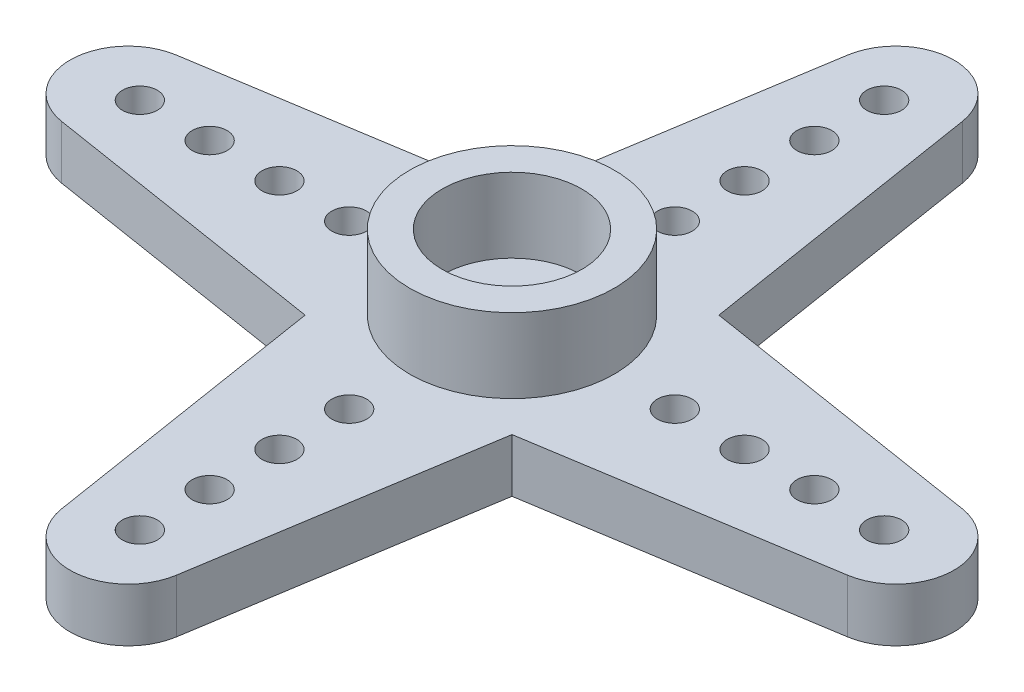
ISO-10303-21;
HEADER;
FILE_DESCRIPTION(('STEP AP214'),'2;1');
FILE_NAME('part.step','',(''),(''),'','','');
FILE_SCHEMA(('AUTOMOTIVE_DESIGN { 1 0 10303 214 1 1 1 1 }'));
ENDSEC;
DATA;
#1=APPLICATION_CONTEXT('core data for automotive mechanical design processes');
#2=APPLICATION_PROTOCOL_DEFINITION('international standard','automotive_design',2000,#1);
#3=PRODUCT_CONTEXT('',#1,'mechanical');
#4=PRODUCT('Part','Part','',(#3));
#5=PRODUCT_RELATED_PRODUCT_CATEGORY('part','',(#4));
#6=PRODUCT_DEFINITION_FORMATION('','',#4);
#7=PRODUCT_DEFINITION_CONTEXT('part definition',#1,'design');
#8=PRODUCT_DEFINITION('design','',#6,#7);
#9=PRODUCT_DEFINITION_SHAPE('','',#8);
#10=(LENGTH_UNIT() NAMED_UNIT(*) SI_UNIT(.MILLI.,.METRE.));
#11=(NAMED_UNIT(*) PLANE_ANGLE_UNIT() SI_UNIT($,.RADIAN.));
#12=(NAMED_UNIT(*) SI_UNIT($,.STERADIAN.) SOLID_ANGLE_UNIT());
#13=UNCERTAINTY_MEASURE_WITH_UNIT(LENGTH_MEASURE(1.E-05),#10,'distance_accuracy_value','');
#14=(GEOMETRIC_REPRESENTATION_CONTEXT(3) GLOBAL_UNCERTAINTY_ASSIGNED_CONTEXT((#13)) GLOBAL_UNIT_ASSIGNED_CONTEXT((#10,
#11,#12)) REPRESENTATION_CONTEXT('',''));
#15=CARTESIAN_POINT('',(0.,0.,0.));
#16=DIRECTION('',(0.,0.,1.));
#17=DIRECTION('',(1.,0.,0.));
#18=AXIS2_PLACEMENT_3D('',#15,#16,#17);
#19=CARTESIAN_POINT('',(5.02767726414761,2.3,-0.799360567392308));
#20=DIRECTION('',(0.987595455307073,0.,-0.157019797021949));
#21=DIRECTION('',(-0.157019797021949,0.,-0.987595455307074));
#22=AXIS2_PLACEMENT_3D('',#19,#20,#21);
#23=PLANE('',#22);
#24=DIRECTION('',(0.157019797021949,0.,0.987595455307074));
#25=VECTOR('',#24,1.);
#26=CARTESIAN_POINT('',(5.02767726414761,2.3,-0.799360567392308));
#27=LINE('',#26,#25);
#28=CARTESIAN_POINT('',(2.46898863826769,2.3,-16.8925494925549));
#29=VERTEX_POINT('',#28);
#30=CARTESIAN_POINT('',(4.44763132459011,2.3,-4.44763132459009));
#31=VERTEX_POINT('',#30);
#32=EDGE_CURVE('E101',#29,#31,#27,.T.);
#33=ORIENTED_EDGE('',*,*,#32,.T.);
#34=DIRECTION('',(0.,-1.,0.));
#35=VECTOR('',#34,1.);
#36=CARTESIAN_POINT('',(4.44763132459011,2.3,-4.44763132459009));
#37=LINE('',#36,#35);
#38=CARTESIAN_POINT('',(4.44763132459011,0.,-4.44763132459009));
#39=VERTEX_POINT('',#38);
#40=EDGE_CURVE('E11',#31,#39,#37,.T.);
#41=ORIENTED_EDGE('',*,*,#40,.T.);
#42=DIRECTION('',(0.157019797021949,0.,0.987595455307074));
#43=VECTOR('',#42,1.);
#44=CARTESIAN_POINT('',(5.02767726414761,0.,-0.799360567392308));
#45=LINE('',#44,#43);
#46=CARTESIAN_POINT('',(2.46898863826769,0.,-16.8925494925549));
#47=VERTEX_POINT('',#46);
#48=EDGE_CURVE('E87',#47,#39,#45,.T.);
#49=ORIENTED_EDGE('',*,*,#48,.F.);
#50=DIRECTION('',(0.,-1.,0.));
#51=VECTOR('',#50,1.);
#52=CARTESIAN_POINT('',(2.46898863826769,2.3,-16.8925494925549));
#53=LINE('',#52,#51);
#54=EDGE_CURVE('E60',#29,#47,#53,.T.);
#55=ORIENTED_EDGE('',*,*,#54,.F.);
#56=EDGE_LOOP('',(#33,#41,#49,#55));
#57=FACE_BOUND('',#56,.T.);
#58=ADVANCED_FACE('F36',(#57),#23,.T.);
#59=CARTESIAN_POINT('',(0.,2.3,0.));
#60=DIRECTION('',(0.,1.,0.));
#61=DIRECTION('',(0.,0.,1.));
#62=AXIS2_PLACEMENT_3D('',#59,#60,#61);
#63=PLANE('',#62);
#64=CARTESIAN_POINT('',(0.,2.3,0.));
#65=DIRECTION('',(0.,1.,0.));
#66=DIRECTION('',(0.,0.,1.));
#67=AXIS2_PLACEMENT_3D('',#64,#65,#66);
#68=CIRCLE('',#67,1.5);
#69=CARTESIAN_POINT('',(0.,2.3,1.5));
#70=VERTEX_POINT('',#69);
#71=EDGE_CURVE('E114',#70,#70,#68,.T.);
#72=ORIENTED_EDGE('',*,*,#71,.F.);
#73=EDGE_LOOP('',(#72));
#74=FACE_BOUND('',#73,.T.);
#75=CARTESIAN_POINT('',(0.,2.3,0.));
#76=DIRECTION('',(0.,1.,0.));
#77=DIRECTION('',(0.,0.,1.));
#78=AXIS2_PLACEMENT_3D('',#75,#76,#77);
#79=CIRCLE('',#78,3.);
#80=CARTESIAN_POINT('',(0.,2.3,3.));
#81=VERTEX_POINT('',#80);
#82=EDGE_CURVE('E78',#81,#81,#79,.T.);
#83=ORIENTED_EDGE('',*,*,#82,.T.);
#84=EDGE_LOOP('',(#83));
#85=FACE_BOUND('',#84,.T.);
#86=ADVANCED_FACE('F165',(#74,#85),#63,.T.);
#87=DIRECTION('',(-0.987595455307073,0.,-0.157019797021953));
#88=VECTOR('',#87,1.);
#89=CARTESIAN_POINT('',(0.799360567392327,2.3,-5.0276772641476));
#90=LINE('',#89,#88);
#91=CARTESIAN_POINT('',(16.8925494925549,2.3,-2.46898863826762));
#92=VERTEX_POINT('',#91);
#93=EDGE_CURVE('E258',#92,#31,#90,.T.);
#94=ORIENTED_EDGE('',*,*,#93,.T.);
#95=ORIENTED_EDGE('',*,*,#32,.F.);
#96=CARTESIAN_POINT('',(0.,2.3,-16.5));
#97=DIRECTION('',(0.,-1.,0.));
#98=DIRECTION('',(0.,0.,-1.));
#99=AXIS2_PLACEMENT_3D('',#96,#97,#98);
#100=CIRCLE('',#99,2.5);
#101=CARTESIAN_POINT('',(-2.46898863826768,2.3,-16.8925494925549));
#102=VERTEX_POINT('',#101);
#103=EDGE_CURVE('E76',#102,#29,#100,.T.);
#104=ORIENTED_EDGE('',*,*,#103,.F.);
#105=DIRECTION('',(-0.15701979702195,0.,0.987595455307073));
#106=VECTOR('',#105,1.);
#107=CARTESIAN_POINT('',(-5.02767726414761,2.3,-0.799360567392309));
#108=LINE('',#107,#106);
#109=CARTESIAN_POINT('',(-4.4476313245901,2.3,-4.44763132459014));
#110=VERTEX_POINT('',#109);
#111=EDGE_CURVE('E122',#102,#110,#108,.T.);
#112=ORIENTED_EDGE('',*,*,#111,.T.);
#113=DIRECTION('',(0.987595455307075,0.,-0.157019797021939));
#114=VECTOR('',#113,1.);
#115=CARTESIAN_POINT('',(-0.799360567392255,2.3,-5.02767726414762));
#116=LINE('',#115,#114);
#117=CARTESIAN_POINT('',(-16.8925494925548,2.3,-2.46898863826786));
#118=VERTEX_POINT('',#117);
#119=EDGE_CURVE('E51',#118,#110,#116,.T.);
#120=ORIENTED_EDGE('',*,*,#119,.F.);
#121=CARTESIAN_POINT('',(-16.5,2.3,-1.74848993491328E-13));
#122=DIRECTION('',(0.,-1.,0.));
#123=DIRECTION('',(-1.,0.,0.));
#124=AXIS2_PLACEMENT_3D('',#121,#122,#123);
#125=CIRCLE('',#124,2.5);
#126=CARTESIAN_POINT('',(-16.8925494925549,2.3,2.46898863826751));
#127=VERTEX_POINT('',#126);
#128=EDGE_CURVE('E352',#127,#118,#125,.T.);
#129=ORIENTED_EDGE('',*,*,#128,.F.);
#130=DIRECTION('',(0.987595455307072,0.,0.15701979702196));
#131=VECTOR('',#130,1.);
#132=CARTESIAN_POINT('',(-0.799360567392362,2.3,5.0276772641476));
#133=LINE('',#132,#131);
#134=CARTESIAN_POINT('',(-4.44763132459011,2.3,4.44763132459006));
#135=VERTEX_POINT('',#134);
#136=EDGE_CURVE('E355',#127,#135,#133,.T.);
#137=ORIENTED_EDGE('',*,*,#136,.T.);
#138=DIRECTION('',(-0.157019797021949,0.,-0.987595455307074));
#139=VECTOR('',#138,1.);
#140=CARTESIAN_POINT('',(-5.02767726414761,2.3,0.799360567392308));
#141=LINE('',#140,#139);
#142=CARTESIAN_POINT('',(-2.46898863826769,2.3,16.8925494925549));
#143=VERTEX_POINT('',#142);
#144=EDGE_CURVE('E277',#143,#135,#141,.T.);
#145=ORIENTED_EDGE('',*,*,#144,.F.);
#146=CARTESIAN_POINT('',(0.,2.3,16.5));
#147=DIRECTION('',(0.,-1.,0.));
#148=DIRECTION('',(0.,0.,1.));
#149=AXIS2_PLACEMENT_3D('',#146,#147,#148);
#150=CIRCLE('',#149,2.5);
#151=CARTESIAN_POINT('',(2.46898863826768,2.3,16.8925494925549));
#152=VERTEX_POINT('',#151);
#153=EDGE_CURVE('E305',#152,#143,#150,.T.);
#154=ORIENTED_EDGE('',*,*,#153,.F.);
#155=DIRECTION('',(0.15701979702195,0.,-0.987595455307073));
#156=VECTOR('',#155,1.);
#157=CARTESIAN_POINT('',(5.02767726414761,2.3,0.799360567392309));
#158=LINE('',#157,#156);
#159=CARTESIAN_POINT('',(4.4476313245901,2.3,4.44763132459012));
#160=VERTEX_POINT('',#159);
#161=EDGE_CURVE('E308',#152,#160,#158,.T.);
#162=ORIENTED_EDGE('',*,*,#161,.T.);
#163=DIRECTION('',(-0.987595455307074,0.,0.157019797021946));
#164=VECTOR('',#163,1.);
#165=CARTESIAN_POINT('',(0.79936056739229,2.3,5.02767726414761));
#166=LINE('',#165,#164);
#167=CARTESIAN_POINT('',(16.8925494925549,2.3,2.46898863826775));
#168=VERTEX_POINT('',#167);
#169=EDGE_CURVE('E227',#168,#160,#166,.T.);
#170=ORIENTED_EDGE('',*,*,#169,.F.);
#171=CARTESIAN_POINT('',(16.5,2.3,0.));
#172=DIRECTION('',(0.,-1.,0.));
#173=DIRECTION('',(1.,0.,0.));
#174=AXIS2_PLACEMENT_3D('',#171,#172,#173);
#175=CIRCLE('',#174,2.5);
#176=EDGE_CURVE('E255',#92,#168,#175,.T.);
#177=ORIENTED_EDGE('',*,*,#176,.F.);
#178=EDGE_LOOP('',(#94,#95,#104,#112,#120,#129,#137,#145,#154,#162,#170,#177));
#179=FACE_BOUND('',#178,.T.);
#180=CARTESIAN_POINT('',(16.,2.3,0.));
#181=DIRECTION('',(0.,-1.,0.));
#182=DIRECTION('',(1.,0.,0.));
#183=AXIS2_PLACEMENT_3D('',#180,#181,#182);
#184=CIRCLE('',#183,0.75);
#185=CARTESIAN_POINT('',(16.75,2.3,0.));
#186=VERTEX_POINT('',#185);
#187=EDGE_CURVE('E260',#186,#186,#184,.T.);
#188=ORIENTED_EDGE('',*,*,#187,.T.);
#189=EDGE_LOOP('',(#188));
#190=FACE_BOUND('',#189,.T.);
#191=CARTESIAN_POINT('',(13.,2.3,0.));
#192=DIRECTION('',(0.,-1.,0.));
#193=DIRECTION('',(1.,0.,0.));
#194=AXIS2_PLACEMENT_3D('',#191,#192,#193);
#195=CIRCLE('',#194,0.750000000000001);
#196=CARTESIAN_POINT('',(13.75,2.3,0.));
#197=VERTEX_POINT('',#196);
#198=EDGE_CURVE('E263',#197,#197,#195,.T.);
#199=ORIENTED_EDGE('',*,*,#198,.T.);
#200=EDGE_LOOP('',(#199));
#201=FACE_BOUND('',#200,.T.);
#202=CARTESIAN_POINT('',(10.,2.3,0.));
#203=DIRECTION('',(0.,-1.,0.));
#204=DIRECTION('',(1.,0.,0.));
#205=AXIS2_PLACEMENT_3D('',#202,#203,#204);
#206=CIRCLE('',#205,0.750000000000001);
#207=CARTESIAN_POINT('',(10.75,2.3,0.));
#208=VERTEX_POINT('',#207);
#209=EDGE_CURVE('E266',#208,#208,#206,.T.);
#210=ORIENTED_EDGE('',*,*,#209,.T.);
#211=EDGE_LOOP('',(#210));
#212=FACE_BOUND('',#211,.T.);
#213=CARTESIAN_POINT('',(7.,2.3,0.));
#214=DIRECTION('',(0.,-1.,0.));
#215=DIRECTION('',(1.,0.,0.));
#216=AXIS2_PLACEMENT_3D('',#213,#214,#215);
#217=CIRCLE('',#216,0.75);
#218=CARTESIAN_POINT('',(7.75,2.3,0.));
#219=VERTEX_POINT('',#218);
#220=EDGE_CURVE('E233',#219,#219,#217,.T.);
#221=ORIENTED_EDGE('',*,*,#220,.T.);
#222=EDGE_LOOP('',(#221));
#223=FACE_BOUND('',#222,.T.);
#224=CARTESIAN_POINT('',(0.,2.3,16.));
#225=DIRECTION('',(0.,-1.,0.));
#226=DIRECTION('',(0.,0.,1.));
#227=AXIS2_PLACEMENT_3D('',#224,#225,#226);
#228=CIRCLE('',#227,0.75);
#229=CARTESIAN_POINT('',(0.,2.3,16.75));
#230=VERTEX_POINT('',#229);
#231=EDGE_CURVE('E311',#230,#230,#228,.T.);
#232=ORIENTED_EDGE('',*,*,#231,.T.);
#233=EDGE_LOOP('',(#232));
#234=FACE_BOUND('',#233,.T.);
#235=CARTESIAN_POINT('',(0.,2.3,13.));
#236=DIRECTION('',(0.,-1.,0.));
#237=DIRECTION('',(0.,0.,1.));
#238=AXIS2_PLACEMENT_3D('',#235,#236,#237);
#239=CIRCLE('',#238,0.750000000000001);
#240=CARTESIAN_POINT('',(0.,2.3,13.75));
#241=VERTEX_POINT('',#240);
#242=EDGE_CURVE('E314',#241,#241,#239,.T.);
#243=ORIENTED_EDGE('',*,*,#242,.T.);
#244=EDGE_LOOP('',(#243));
#245=FACE_BOUND('',#244,.T.);
#246=CARTESIAN_POINT('',(0.,2.3,10.));
#247=DIRECTION('',(0.,-1.,0.));
#248=DIRECTION('',(0.,0.,1.));
#249=AXIS2_PLACEMENT_3D('',#246,#247,#248);
#250=CIRCLE('',#249,0.750000000000001);
#251=CARTESIAN_POINT('',(0.,2.3,10.75));
#252=VERTEX_POINT('',#251);
#253=EDGE_CURVE('E317',#252,#252,#250,.T.);
#254=ORIENTED_EDGE('',*,*,#253,.T.);
#255=EDGE_LOOP('',(#254));
#256=FACE_BOUND('',#255,.T.);
#257=CARTESIAN_POINT('',(0.,2.3,7.));
#258=DIRECTION('',(0.,-1.,0.));
#259=DIRECTION('',(0.,0.,1.));
#260=AXIS2_PLACEMENT_3D('',#257,#258,#259);
#261=CIRCLE('',#260,0.75);
#262=CARTESIAN_POINT('',(0.,2.3,7.75));
#263=VERTEX_POINT('',#262);
#264=EDGE_CURVE('E283',#263,#263,#261,.T.);
#265=ORIENTED_EDGE('',*,*,#264,.T.);
#266=EDGE_LOOP('',(#265));
#267=FACE_BOUND('',#266,.T.);
#268=CARTESIAN_POINT('',(-7.,2.3,0.));
#269=DIRECTION('',(0.,-1.,0.));
#270=DIRECTION('',(-1.,0.,0.));
#271=AXIS2_PLACEMENT_3D('',#268,#269,#270);
#272=CIRCLE('',#271,0.75);
#273=CARTESIAN_POINT('',(-7.75,2.3,0.));
#274=VERTEX_POINT('',#273);
#275=EDGE_CURVE('E332',#274,#274,#272,.T.);
#276=ORIENTED_EDGE('',*,*,#275,.T.);
#277=EDGE_LOOP('',(#276));
#278=FACE_BOUND('',#277,.T.);
#279=CARTESIAN_POINT('',(-10.,2.3,-1.05969086964441E-13));
#280=DIRECTION('',(0.,-1.,0.));
#281=DIRECTION('',(-1.,0.,0.));
#282=AXIS2_PLACEMENT_3D('',#279,#280,#281);
#283=CIRCLE('',#282,0.750000000000001);
#284=CARTESIAN_POINT('',(-10.75,2.3,-1.13824919976838E-13));
#285=VERTEX_POINT('',#284);
#286=EDGE_CURVE('E364',#285,#285,#283,.T.);
#287=ORIENTED_EDGE('',*,*,#286,.T.);
#288=EDGE_LOOP('',(#287));
#289=FACE_BOUND('',#288,.T.);
#290=CARTESIAN_POINT('',(-13.,2.3,-1.37759813053774E-13));
#291=DIRECTION('',(0.,-1.,0.));
#292=DIRECTION('',(-1.,0.,0.));
#293=AXIS2_PLACEMENT_3D('',#290,#291,#292);
#294=CIRCLE('',#293,0.750000000000001);
#295=CARTESIAN_POINT('',(-13.75,2.3,-1.45615646066171E-13));
#296=VERTEX_POINT('',#295);
#297=EDGE_CURVE('E361',#296,#296,#294,.T.);
#298=ORIENTED_EDGE('',*,*,#297,.T.);
#299=EDGE_LOOP('',(#298));
#300=FACE_BOUND('',#299,.T.);
#301=CARTESIAN_POINT('',(-16.,2.3,-1.69550539143106E-13));
#302=DIRECTION('',(0.,-1.,0.));
#303=DIRECTION('',(-1.,0.,0.));
#304=AXIS2_PLACEMENT_3D('',#301,#302,#303);
#305=CIRCLE('',#304,0.75);
#306=CARTESIAN_POINT('',(-16.75,2.3,-1.77406372155503E-13));
#307=VERTEX_POINT('',#306);
#308=EDGE_CURVE('E358',#307,#307,#305,.T.);
#309=ORIENTED_EDGE('',*,*,#308,.T.);
#310=EDGE_LOOP('',(#309));
#311=FACE_BOUND('',#310,.T.);
#312=CARTESIAN_POINT('',(0.,2.3,0.));
#313=DIRECTION('',(0.,1.,0.));
#314=DIRECTION('',(0.,0.,1.));
#315=AXIS2_PLACEMENT_3D('',#312,#313,#314);
#316=CIRCLE('',#315,4.4);
#317=CARTESIAN_POINT('',(0.,2.3,4.4));
#318=VERTEX_POINT('',#317);
#319=EDGE_CURVE('E111',#318,#318,#316,.T.);
#320=ORIENTED_EDGE('',*,*,#319,.F.);
#321=EDGE_LOOP('',(#320));
#322=FACE_BOUND('',#321,.T.);
#323=CARTESIAN_POINT('',(0.,2.3,-7.));
#324=DIRECTION('',(0.,-1.,0.));
#325=DIRECTION('',(0.,0.,-1.));
#326=AXIS2_PLACEMENT_3D('',#323,#324,#325);
#327=CIRCLE('',#326,0.75);
#328=CARTESIAN_POINT('',(0.,2.3,-7.75));
#329=VERTEX_POINT('',#328);
#330=EDGE_CURVE('E93',#329,#329,#327,.T.);
#331=ORIENTED_EDGE('',*,*,#330,.T.);
#332=EDGE_LOOP('',(#331));
#333=FACE_BOUND('',#332,.T.);
#334=CARTESIAN_POINT('',(0.,2.3,-10.));
#335=DIRECTION('',(0.,-1.,0.));
#336=DIRECTION('',(0.,0.,-1.));
#337=AXIS2_PLACEMENT_3D('',#334,#335,#336);
#338=CIRCLE('',#337,0.750000000000001);
#339=CARTESIAN_POINT('',(0.,2.3,-10.75));
#340=VERTEX_POINT('',#339);
#341=EDGE_CURVE('E96',#340,#340,#338,.T.);
#342=ORIENTED_EDGE('',*,*,#341,.T.);
#343=EDGE_LOOP('',(#342));
#344=FACE_BOUND('',#343,.T.);
#345=CARTESIAN_POINT('',(0.,2.3,-13.));
#346=DIRECTION('',(0.,-1.,0.));
#347=DIRECTION('',(0.,0.,-1.));
#348=AXIS2_PLACEMENT_3D('',#345,#346,#347);
#349=CIRCLE('',#348,0.750000000000001);
#350=CARTESIAN_POINT('',(0.,2.3,-13.75));
#351=VERTEX_POINT('',#350);
#352=EDGE_CURVE('E135',#351,#351,#349,.T.);
#353=ORIENTED_EDGE('',*,*,#352,.T.);
#354=EDGE_LOOP('',(#353));
#355=FACE_BOUND('',#354,.T.);
#356=CARTESIAN_POINT('',(0.,2.3,-16.));
#357=DIRECTION('',(0.,-1.,0.));
#358=DIRECTION('',(0.,0.,-1.));
#359=AXIS2_PLACEMENT_3D('',#356,#357,#358);
#360=CIRCLE('',#359,0.75);
#361=CARTESIAN_POINT('',(0.,2.3,-16.75));
#362=VERTEX_POINT('',#361);
#363=EDGE_CURVE('E131',#362,#362,#360,.T.);
#364=ORIENTED_EDGE('',*,*,#363,.T.);
#365=EDGE_LOOP('',(#364));
#366=FACE_BOUND('',#365,.T.);
#367=ADVANCED_FACE('F127',(#179,#190,#201,#212,#223,#234,#245,#256,#267,#278,#289,#300,#311,
#322,#333,#344,#355,#366),#63,.T.);
#368=CARTESIAN_POINT('',(0.,0.,0.));
#369=DIRECTION('',(0.,1.,0.));
#370=DIRECTION('',(0.,0.,1.));
#371=AXIS2_PLACEMENT_3D('',#368,#369,#370);
#372=PLANE('',#371);
#373=ORIENTED_EDGE('',*,*,#48,.T.);
#374=DIRECTION('',(-0.987595455307073,0.,-0.157019797021953));
#375=VECTOR('',#374,1.);
#376=CARTESIAN_POINT('',(0.799360567392327,0.,-5.0276772641476));
#377=LINE('',#376,#375);
#378=CARTESIAN_POINT('',(16.8925494925549,0.,-2.46898863826762));
#379=VERTEX_POINT('',#378);
#380=EDGE_CURVE('E237',#379,#39,#377,.T.);
#381=ORIENTED_EDGE('',*,*,#380,.F.);
#382=CARTESIAN_POINT('',(16.5,0.,0.));
#383=DIRECTION('',(0.,-1.,0.));
#384=DIRECTION('',(1.,0.,0.));
#385=AXIS2_PLACEMENT_3D('',#382,#383,#384);
#386=CIRCLE('',#385,2.5);
#387=CARTESIAN_POINT('',(16.8925494925549,0.,2.46898863826775));
#388=VERTEX_POINT('',#387);
#389=EDGE_CURVE('E234',#379,#388,#386,.T.);
#390=ORIENTED_EDGE('',*,*,#389,.T.);
#391=DIRECTION('',(-0.987595455307074,0.,0.157019797021946));
#392=VECTOR('',#391,1.);
#393=CARTESIAN_POINT('',(0.79936056739229,0.,5.02767726414761));
#394=LINE('',#393,#392);
#395=CARTESIAN_POINT('',(4.4476313245901,0.,4.44763132459012));
#396=VERTEX_POINT('',#395);
#397=EDGE_CURVE('E230',#388,#396,#394,.T.);
#398=ORIENTED_EDGE('',*,*,#397,.T.);
#399=DIRECTION('',(0.15701979702195,0.,-0.987595455307073));
#400=VECTOR('',#399,1.);
#401=CARTESIAN_POINT('',(5.02767726414761,0.,0.799360567392309));
#402=LINE('',#401,#400);
#403=CARTESIAN_POINT('',(2.46898863826768,0.,16.8925494925549));
#404=VERTEX_POINT('',#403);
#405=EDGE_CURVE('E287',#404,#396,#402,.T.);
#406=ORIENTED_EDGE('',*,*,#405,.F.);
#407=CARTESIAN_POINT('',(0.,0.,16.5));
#408=DIRECTION('',(0.,-1.,0.));
#409=DIRECTION('',(0.,0.,1.));
#410=AXIS2_PLACEMENT_3D('',#407,#408,#409);
#411=CIRCLE('',#410,2.5);
#412=CARTESIAN_POINT('',(-2.46898863826769,0.,16.8925494925549));
#413=VERTEX_POINT('',#412);
#414=EDGE_CURVE('E284',#404,#413,#411,.T.);
#415=ORIENTED_EDGE('',*,*,#414,.T.);
#416=DIRECTION('',(-0.157019797021949,0.,-0.987595455307074));
#417=VECTOR('',#416,1.);
#418=CARTESIAN_POINT('',(-5.02767726414761,0.,0.799360567392308));
#419=LINE('',#418,#417);
#420=CARTESIAN_POINT('',(-4.44763132459011,0.,4.44763132459006));
#421=VERTEX_POINT('',#420);
#422=EDGE_CURVE('E280',#413,#421,#419,.T.);
#423=ORIENTED_EDGE('',*,*,#422,.T.);
#424=DIRECTION('',(0.987595455307072,0.,0.15701979702196));
#425=VECTOR('',#424,1.);
#426=CARTESIAN_POINT('',(-0.799360567392362,0.,5.0276772641476));
#427=LINE('',#426,#425);
#428=CARTESIAN_POINT('',(-16.8925494925549,0.,2.46898863826751));
#429=VERTEX_POINT('',#428);
#430=EDGE_CURVE('E336',#429,#421,#427,.T.);
#431=ORIENTED_EDGE('',*,*,#430,.F.);
#432=CARTESIAN_POINT('',(-16.5,0.,-1.74848993491328E-13));
#433=DIRECTION('',(0.,-1.,0.));
#434=DIRECTION('',(-1.,0.,0.));
#435=AXIS2_PLACEMENT_3D('',#432,#433,#434);
#436=CIRCLE('',#435,2.5);
#437=CARTESIAN_POINT('',(-16.8925494925548,0.,-2.46898863826786));
#438=VERTEX_POINT('',#437);
#439=EDGE_CURVE('E333',#429,#438,#436,.T.);
#440=ORIENTED_EDGE('',*,*,#439,.T.);
#441=DIRECTION('',(0.987595455307075,0.,-0.157019797021939));
#442=VECTOR('',#441,1.);
#443=CARTESIAN_POINT('',(-0.799360567392255,0.,-5.02767726414762));
#444=LINE('',#443,#442);
#445=CARTESIAN_POINT('',(-4.4476313245901,0.,-4.44763132459014));
#446=VERTEX_POINT('',#445);
#447=EDGE_CURVE('E330',#438,#446,#444,.T.);
#448=ORIENTED_EDGE('',*,*,#447,.T.);
#449=DIRECTION('',(-0.15701979702195,0.,0.987595455307073));
#450=VECTOR('',#449,1.);
#451=CARTESIAN_POINT('',(-5.02767726414761,0.,-0.799360567392309));
#452=LINE('',#451,#450);
#453=CARTESIAN_POINT('',(-2.46898863826768,0.,-16.8925494925549));
#454=VERTEX_POINT('',#453);
#455=EDGE_CURVE('E90',#454,#446,#452,.T.);
#456=ORIENTED_EDGE('',*,*,#455,.F.);
#457=CARTESIAN_POINT('',(0.,0.,-16.5));
#458=DIRECTION('',(0.,-1.,0.));
#459=DIRECTION('',(0.,0.,-1.));
#460=AXIS2_PLACEMENT_3D('',#457,#458,#459);
#461=CIRCLE('',#460,2.5);
#462=EDGE_CURVE('E74',#454,#47,#461,.T.);
#463=ORIENTED_EDGE('',*,*,#462,.T.);
#464=EDGE_LOOP('',(#373,#381,#390,#398,#406,#415,#423,#431,#440,#448,#456,#463));
#465=FACE_BOUND('',#464,.T.);
#466=CARTESIAN_POINT('',(-16.,0.,-1.69550539143106E-13));
#467=DIRECTION('',(0.,-1.,0.));
#468=DIRECTION('',(-1.,0.,0.));
#469=AXIS2_PLACEMENT_3D('',#466,#467,#468);
#470=CIRCLE('',#469,0.75);
#471=CARTESIAN_POINT('',(-16.75,0.,-1.77406372155503E-13));
#472=VERTEX_POINT('',#471);
#473=EDGE_CURVE('E339',#472,#472,#470,.T.);
#474=ORIENTED_EDGE('',*,*,#473,.F.);
#475=EDGE_LOOP('',(#474));
#476=FACE_BOUND('',#475,.T.);
#477=CARTESIAN_POINT('',(-13.,0.,-1.37759813053774E-13));
#478=DIRECTION('',(0.,-1.,0.));
#479=DIRECTION('',(-1.,0.,0.));
#480=AXIS2_PLACEMENT_3D('',#477,#478,#479);
#481=CIRCLE('',#480,0.750000000000001);
#482=CARTESIAN_POINT('',(-13.75,0.,-1.45615646066171E-13));
#483=VERTEX_POINT('',#482);
#484=EDGE_CURVE('E342',#483,#483,#481,.T.);
#485=ORIENTED_EDGE('',*,*,#484,.F.);
#486=EDGE_LOOP('',(#485));
#487=FACE_BOUND('',#486,.T.);
#488=CARTESIAN_POINT('',(-10.,0.,-1.05969086964441E-13));
#489=DIRECTION('',(0.,-1.,0.));
#490=DIRECTION('',(-1.,0.,0.));
#491=AXIS2_PLACEMENT_3D('',#488,#489,#490);
#492=CIRCLE('',#491,0.750000000000001);
#493=CARTESIAN_POINT('',(-10.75,0.,-1.13824919976838E-13));
#494=VERTEX_POINT('',#493);
#495=EDGE_CURVE('E345',#494,#494,#492,.T.);
#496=ORIENTED_EDGE('',*,*,#495,.F.);
#497=EDGE_LOOP('',(#496));
#498=FACE_BOUND('',#497,.T.);
#499=CARTESIAN_POINT('',(-7.,0.,0.));
#500=DIRECTION('',(0.,-1.,0.));
#501=DIRECTION('',(-1.,0.,0.));
#502=AXIS2_PLACEMENT_3D('',#499,#500,#501);
#503=CIRCLE('',#502,0.75);
#504=CARTESIAN_POINT('',(-7.75,0.,0.));
#505=VERTEX_POINT('',#504);
#506=EDGE_CURVE('E348',#505,#505,#503,.T.);
#507=ORIENTED_EDGE('',*,*,#506,.F.);
#508=EDGE_LOOP('',(#507));
#509=FACE_BOUND('',#508,.T.);
#510=CARTESIAN_POINT('',(0.,0.,16.));
#511=DIRECTION('',(0.,-1.,0.));
#512=DIRECTION('',(0.,0.,1.));
#513=AXIS2_PLACEMENT_3D('',#510,#511,#512);
#514=CIRCLE('',#513,0.75);
#515=CARTESIAN_POINT('',(0.,0.,16.75));
#516=VERTEX_POINT('',#515);
#517=EDGE_CURVE('E290',#516,#516,#514,.T.);
#518=ORIENTED_EDGE('',*,*,#517,.F.);
#519=EDGE_LOOP('',(#518));
#520=FACE_BOUND('',#519,.T.);
#521=CARTESIAN_POINT('',(0.,0.,13.));
#522=DIRECTION('',(0.,-1.,0.));
#523=DIRECTION('',(0.,0.,1.));
#524=AXIS2_PLACEMENT_3D('',#521,#522,#523);
#525=CIRCLE('',#524,0.750000000000001);
#526=CARTESIAN_POINT('',(0.,0.,13.75));
#527=VERTEX_POINT('',#526);
#528=EDGE_CURVE('E293',#527,#527,#525,.T.);
#529=ORIENTED_EDGE('',*,*,#528,.F.);
#530=EDGE_LOOP('',(#529));
#531=FACE_BOUND('',#530,.T.);
#532=CARTESIAN_POINT('',(0.,0.,10.));
#533=DIRECTION('',(0.,-1.,0.));
#534=DIRECTION('',(0.,0.,1.));
#535=AXIS2_PLACEMENT_3D('',#532,#533,#534);
#536=CIRCLE('',#535,0.750000000000001);
#537=CARTESIAN_POINT('',(0.,0.,10.75));
#538=VERTEX_POINT('',#537);
#539=EDGE_CURVE('E296',#538,#538,#536,.T.);
#540=ORIENTED_EDGE('',*,*,#539,.F.);
#541=EDGE_LOOP('',(#540));
#542=FACE_BOUND('',#541,.T.);
#543=CARTESIAN_POINT('',(0.,0.,7.));
#544=DIRECTION('',(0.,-1.,0.));
#545=DIRECTION('',(0.,0.,1.));
#546=AXIS2_PLACEMENT_3D('',#543,#544,#545);
#547=CIRCLE('',#546,0.75);
#548=CARTESIAN_POINT('',(0.,0.,7.75));
#549=VERTEX_POINT('',#548);
#550=EDGE_CURVE('E299',#549,#549,#547,.T.);
#551=ORIENTED_EDGE('',*,*,#550,.F.);
#552=EDGE_LOOP('',(#551));
#553=FACE_BOUND('',#552,.T.);
#554=CARTESIAN_POINT('',(16.,0.,0.));
#555=DIRECTION('',(0.,-1.,0.));
#556=DIRECTION('',(1.,0.,0.));
#557=AXIS2_PLACEMENT_3D('',#554,#555,#556);
#558=CIRCLE('',#557,0.75);
#559=CARTESIAN_POINT('',(16.75,0.,0.));
#560=VERTEX_POINT('',#559);
#561=EDGE_CURVE('E240',#560,#560,#558,.T.);
#562=ORIENTED_EDGE('',*,*,#561,.F.);
#563=EDGE_LOOP('',(#562));
#564=FACE_BOUND('',#563,.T.);
#565=CARTESIAN_POINT('',(13.,0.,0.));
#566=DIRECTION('',(0.,-1.,0.));
#567=DIRECTION('',(1.,0.,0.));
#568=AXIS2_PLACEMENT_3D('',#565,#566,#567);
#569=CIRCLE('',#568,0.750000000000001);
#570=CARTESIAN_POINT('',(13.75,0.,0.));
#571=VERTEX_POINT('',#570);
#572=EDGE_CURVE('E243',#571,#571,#569,.T.);
#573=ORIENTED_EDGE('',*,*,#572,.F.);
#574=EDGE_LOOP('',(#573));
#575=FACE_BOUND('',#574,.T.);
#576=CARTESIAN_POINT('',(10.,0.,0.));
#577=DIRECTION('',(0.,-1.,0.));
#578=DIRECTION('',(1.,0.,0.));
#579=AXIS2_PLACEMENT_3D('',#576,#577,#578);
#580=CIRCLE('',#579,0.750000000000001);
#581=CARTESIAN_POINT('',(10.75,0.,0.));
#582=VERTEX_POINT('',#581);
#583=EDGE_CURVE('E246',#582,#582,#580,.T.);
#584=ORIENTED_EDGE('',*,*,#583,.F.);
#585=EDGE_LOOP('',(#584));
#586=FACE_BOUND('',#585,.T.);
#587=CARTESIAN_POINT('',(7.,0.,0.));
#588=DIRECTION('',(0.,-1.,0.));
#589=DIRECTION('',(1.,0.,0.));
#590=AXIS2_PLACEMENT_3D('',#587,#588,#589);
#591=CIRCLE('',#590,0.75);
#592=CARTESIAN_POINT('',(7.75,0.,0.));
#593=VERTEX_POINT('',#592);
#594=EDGE_CURVE('E249',#593,#593,#591,.T.);
#595=ORIENTED_EDGE('',*,*,#594,.F.);
#596=EDGE_LOOP('',(#595));
#597=FACE_BOUND('',#596,.T.);
#598=CARTESIAN_POINT('',(0.,0.,0.));
#599=DIRECTION('',(0.,1.,0.));
#600=DIRECTION('',(0.,0.,1.));
#601=AXIS2_PLACEMENT_3D('',#598,#599,#600);
#602=CIRCLE('',#601,1.5);
#603=CARTESIAN_POINT('',(0.,0.,1.5));
#604=VERTEX_POINT('',#603);
#605=EDGE_CURVE('E110',#604,#604,#602,.T.);
#606=ORIENTED_EDGE('',*,*,#605,.T.);
#607=EDGE_LOOP('',(#606));
#608=FACE_BOUND('',#607,.T.);
#609=CARTESIAN_POINT('',(0.,0.,-7.));
#610=DIRECTION('',(0.,-1.,0.));
#611=DIRECTION('',(0.,0.,-1.));
#612=AXIS2_PLACEMENT_3D('',#609,#610,#611);
#613=CIRCLE('',#612,0.75);
#614=CARTESIAN_POINT('',(0.,0.,-7.75));
#615=VERTEX_POINT('',#614);
#616=EDGE_CURVE('E140',#615,#615,#613,.T.);
#617=ORIENTED_EDGE('',*,*,#616,.F.);
#618=EDGE_LOOP('',(#617));
#619=FACE_BOUND('',#618,.T.);
#620=CARTESIAN_POINT('',(0.,0.,-10.));
#621=DIRECTION('',(0.,-1.,0.));
#622=DIRECTION('',(0.,0.,-1.));
#623=AXIS2_PLACEMENT_3D('',#620,#621,#622);
#624=CIRCLE('',#623,0.750000000000001);
#625=CARTESIAN_POINT('',(0.,0.,-10.75));
#626=VERTEX_POINT('',#625);
#627=EDGE_CURVE('E143',#626,#626,#624,.T.);
#628=ORIENTED_EDGE('',*,*,#627,.F.);
#629=EDGE_LOOP('',(#628));
#630=FACE_BOUND('',#629,.T.);
#631=CARTESIAN_POINT('',(0.,0.,-13.));
#632=DIRECTION('',(0.,-1.,0.));
#633=DIRECTION('',(0.,0.,-1.));
#634=AXIS2_PLACEMENT_3D('',#631,#632,#633);
#635=CIRCLE('',#634,0.750000000000001);
#636=CARTESIAN_POINT('',(0.,0.,-13.75));
#637=VERTEX_POINT('',#636);
#638=EDGE_CURVE('E147',#637,#637,#635,.T.);
#639=ORIENTED_EDGE('',*,*,#638,.F.);
#640=EDGE_LOOP('',(#639));
#641=FACE_BOUND('',#640,.T.);
#642=CARTESIAN_POINT('',(0.,0.,-16.));
#643=DIRECTION('',(0.,-1.,0.));
#644=DIRECTION('',(0.,0.,-1.));
#645=AXIS2_PLACEMENT_3D('',#642,#643,#644);
#646=CIRCLE('',#645,0.75);
#647=CARTESIAN_POINT('',(0.,0.,-16.75));
#648=VERTEX_POINT('',#647);
#649=EDGE_CURVE('E150',#648,#648,#646,.T.);
#650=ORIENTED_EDGE('',*,*,#649,.F.);
#651=EDGE_LOOP('',(#650));
#652=FACE_BOUND('',#651,.T.);
#653=ADVANCED_FACE('F38',(#465,#476,#487,#498,#509,#520,#531,#542,#553,#564,#575,#586,#597,#608,
#619,#630,#641,#652),#372,.F.);
#654=CARTESIAN_POINT('',(0.,2.3,0.));
#655=DIRECTION('',(0.,-1.,0.));
#656=DIRECTION('',(0.,0.,-1.));
#657=AXIS2_PLACEMENT_3D('',#654,#655,#656);
#658=CYLINDRICAL_SURFACE('',#657,1.5);
#659=ORIENTED_EDGE('',*,*,#71,.T.);
#660=EDGE_LOOP('',(#659));
#661=FACE_BOUND('',#660,.T.);
#662=ORIENTED_EDGE('',*,*,#605,.F.);
#663=EDGE_LOOP('',(#662));
#664=FACE_BOUND('',#663,.T.);
#665=ADVANCED_FACE('F157',(#661,#664),#658,.F.);
#666=CARTESIAN_POINT('',(0.,5.5,0.));
#667=DIRECTION('',(0.,1.,0.));
#668=DIRECTION('',(0.,0.,1.));
#669=AXIS2_PLACEMENT_3D('',#666,#667,#668);
#670=PLANE('',#669);
#671=CARTESIAN_POINT('',(0.,5.5,0.));
#672=DIRECTION('',(0.,1.,0.));
#673=DIRECTION('',(0.,0.,1.));
#674=AXIS2_PLACEMENT_3D('',#671,#672,#673);
#675=CIRCLE('',#674,4.4);
#676=CARTESIAN_POINT('',(0.,5.5,4.4));
#677=VERTEX_POINT('',#676);
#678=EDGE_CURVE('E105',#677,#677,#675,.T.);
#679=ORIENTED_EDGE('',*,*,#678,.T.);
#680=EDGE_LOOP('',(#679));
#681=FACE_BOUND('',#680,.T.);
#682=CARTESIAN_POINT('',(0.,5.5,0.));
#683=DIRECTION('',(0.,1.,0.));
#684=DIRECTION('',(0.,0.,1.));
#685=AXIS2_PLACEMENT_3D('',#682,#683,#684);
#686=CIRCLE('',#685,3.);
#687=CARTESIAN_POINT('',(0.,5.5,3.));
#688=VERTEX_POINT('',#687);
#689=EDGE_CURVE('E102',#688,#688,#686,.T.);
#690=ORIENTED_EDGE('',*,*,#689,.F.);
#691=EDGE_LOOP('',(#690));
#692=FACE_BOUND('',#691,.T.);
#693=ADVANCED_FACE('F162',(#681,#692),#670,.T.);
#694=CARTESIAN_POINT('',(0.,5.5,0.));
#695=DIRECTION('',(0.,-1.,0.));
#696=DIRECTION('',(0.,0.,-1.));
#697=AXIS2_PLACEMENT_3D('',#694,#695,#696);
#698=CYLINDRICAL_SURFACE('',#697,4.4);
#699=ORIENTED_EDGE('',*,*,#678,.F.);
#700=EDGE_LOOP('',(#699));
#701=FACE_BOUND('',#700,.T.);
#702=ORIENTED_EDGE('',*,*,#319,.T.);
#703=EDGE_LOOP('',(#702));
#704=FACE_BOUND('',#703,.T.);
#705=ADVANCED_FACE('F199',(#701,#704),#698,.T.);
#706=CARTESIAN_POINT('',(0.,5.5,0.));
#707=DIRECTION('',(0.,-1.,0.));
#708=DIRECTION('',(0.,0.,-1.));
#709=AXIS2_PLACEMENT_3D('',#706,#707,#708);
#710=CYLINDRICAL_SURFACE('',#709,3.);
#711=ORIENTED_EDGE('',*,*,#689,.T.);
#712=EDGE_LOOP('',(#711));
#713=FACE_BOUND('',#712,.T.);
#714=ORIENTED_EDGE('',*,*,#82,.F.);
#715=EDGE_LOOP('',(#714));
#716=FACE_BOUND('',#715,.T.);
#717=ADVANCED_FACE('F178',(#713,#716),#710,.F.);
#718=CARTESIAN_POINT('',(0.,2.3,-16.5));
#719=DIRECTION('',(0.,-1.,0.));
#720=DIRECTION('',(0.,0.,-1.));
#721=AXIS2_PLACEMENT_3D('',#718,#719,#720);
#722=CYLINDRICAL_SURFACE('',#721,2.5);
#723=ORIENTED_EDGE('',*,*,#462,.F.);
#724=DIRECTION('',(0.,-1.,0.));
#725=VECTOR('',#724,1.);
#726=CARTESIAN_POINT('',(-2.46898863826768,2.3,-16.8925494925549));
#727=LINE('',#726,#725);
#728=EDGE_CURVE('E79',#102,#454,#727,.T.);
#729=ORIENTED_EDGE('',*,*,#728,.F.);
#730=ORIENTED_EDGE('',*,*,#103,.T.);
#731=ORIENTED_EDGE('',*,*,#54,.T.);
#732=EDGE_LOOP('',(#723,#729,#730,#731));
#733=FACE_BOUND('',#732,.T.);
#734=ADVANCED_FACE('F73',(#733),#722,.T.);
#735=CARTESIAN_POINT('',(0.,2.3,-16.));
#736=DIRECTION('',(0.,-1.,0.));
#737=DIRECTION('',(0.,0.,-1.));
#738=AXIS2_PLACEMENT_3D('',#735,#736,#737);
#739=CYLINDRICAL_SURFACE('',#738,0.75);
#740=ORIENTED_EDGE('',*,*,#363,.F.);
#741=EDGE_LOOP('',(#740));
#742=FACE_BOUND('',#741,.T.);
#743=ORIENTED_EDGE('',*,*,#649,.T.);
#744=EDGE_LOOP('',(#743));
#745=FACE_BOUND('',#744,.T.);
#746=ADVANCED_FACE('F154',(#742,#745),#739,.F.);
#747=CARTESIAN_POINT('',(0.,2.3,-13.));
#748=DIRECTION('',(0.,-1.,0.));
#749=DIRECTION('',(0.,0.,-1.));
#750=AXIS2_PLACEMENT_3D('',#747,#748,#749);
#751=CYLINDRICAL_SURFACE('',#750,0.750000000000001);
#752=ORIENTED_EDGE('',*,*,#352,.F.);
#753=EDGE_LOOP('',(#752));
#754=FACE_BOUND('',#753,.T.);
#755=ORIENTED_EDGE('',*,*,#638,.T.);
#756=EDGE_LOOP('',(#755));
#757=FACE_BOUND('',#756,.T.);
#758=ADVANCED_FACE('F185',(#754,#757),#751,.F.);
#759=CARTESIAN_POINT('',(0.,2.3,-10.));
#760=DIRECTION('',(0.,-1.,0.));
#761=DIRECTION('',(0.,0.,-1.));
#762=AXIS2_PLACEMENT_3D('',#759,#760,#761);
#763=CYLINDRICAL_SURFACE('',#762,0.750000000000001);
#764=ORIENTED_EDGE('',*,*,#341,.F.);
#765=EDGE_LOOP('',(#764));
#766=FACE_BOUND('',#765,.T.);
#767=ORIENTED_EDGE('',*,*,#627,.T.);
#768=EDGE_LOOP('',(#767));
#769=FACE_BOUND('',#768,.T.);
#770=ADVANCED_FACE('F189',(#766,#769),#763,.F.);
#771=CARTESIAN_POINT('',(0.,2.3,-7.));
#772=DIRECTION('',(0.,-1.,0.));
#773=DIRECTION('',(0.,0.,-1.));
#774=AXIS2_PLACEMENT_3D('',#771,#772,#773);
#775=CYLINDRICAL_SURFACE('',#774,0.75);
#776=ORIENTED_EDGE('',*,*,#330,.F.);
#777=EDGE_LOOP('',(#776));
#778=FACE_BOUND('',#777,.T.);
#779=ORIENTED_EDGE('',*,*,#616,.T.);
#780=EDGE_LOOP('',(#779));
#781=FACE_BOUND('',#780,.T.);
#782=ADVANCED_FACE('F182',(#778,#781),#775,.F.);
#783=CARTESIAN_POINT('',(-5.02767726414761,2.3,-0.799360567392309));
#784=DIRECTION('',(0.987595455307073,0.,0.15701979702195));
#785=DIRECTION('',(0.15701979702195,0.,-0.987595455307073));
#786=AXIS2_PLACEMENT_3D('',#783,#784,#785);
#787=PLANE('',#786);
#788=ORIENTED_EDGE('',*,*,#455,.T.);
#789=DIRECTION('',(0.,1.,0.));
#790=VECTOR('',#789,1.);
#791=CARTESIAN_POINT('',(-4.4476313245901,2.3,-4.44763132459014));
#792=LINE('',#791,#790);
#793=EDGE_CURVE('E44',#446,#110,#792,.T.);
#794=ORIENTED_EDGE('',*,*,#793,.T.);
#795=ORIENTED_EDGE('',*,*,#111,.F.);
#796=ORIENTED_EDGE('',*,*,#728,.T.);
#797=EDGE_LOOP('',(#788,#794,#795,#796));
#798=FACE_BOUND('',#797,.T.);
#799=ADVANCED_FACE('F121',(#798),#787,.F.);
#800=CARTESIAN_POINT('',(-0.799360567392255,2.3,-5.02767726414762));
#801=DIRECTION('',(-0.157019797021939,0.,-0.987595455307075));
#802=DIRECTION('',(-0.987595455307075,0.,0.157019797021939));
#803=AXIS2_PLACEMENT_3D('',#800,#801,#802);
#804=PLANE('',#803);
#805=ORIENTED_EDGE('',*,*,#793,.F.);
#806=ORIENTED_EDGE('',*,*,#447,.F.);
#807=DIRECTION('',(0.,-1.,0.));
#808=VECTOR('',#807,1.);
#809=CARTESIAN_POINT('',(-16.8925494925548,2.3,-2.46898863826786));
#810=LINE('',#809,#808);
#811=EDGE_CURVE('E324',#118,#438,#810,.T.);
#812=ORIENTED_EDGE('',*,*,#811,.F.);
#813=ORIENTED_EDGE('',*,*,#119,.T.);
#814=EDGE_LOOP('',(#805,#806,#812,#813));
#815=FACE_BOUND('',#814,.T.);
#816=ADVANCED_FACE('F181',(#815),#804,.T.);
#817=CARTESIAN_POINT('',(0.79936056739229,2.3,5.02767726414761));
#818=DIRECTION('',(0.157019797021946,0.,0.987595455307074));
#819=DIRECTION('',(0.987595455307074,0.,-0.157019797021946));
#820=AXIS2_PLACEMENT_3D('',#817,#818,#819);
#821=PLANE('',#820);
#822=ORIENTED_EDGE('',*,*,#169,.T.);
#823=DIRECTION('',(0.,-1.,0.));
#824=VECTOR('',#823,1.);
#825=CARTESIAN_POINT('',(4.4476313245901,2.3,4.44763132459012));
#826=LINE('',#825,#824);
#827=EDGE_CURVE('E252',#160,#396,#826,.T.);
#828=ORIENTED_EDGE('',*,*,#827,.T.);
#829=ORIENTED_EDGE('',*,*,#397,.F.);
#830=DIRECTION('',(0.,-1.,0.));
#831=VECTOR('',#830,1.);
#832=CARTESIAN_POINT('',(16.8925494925549,2.3,2.46898863826775));
#833=LINE('',#832,#831);
#834=EDGE_CURVE('E144',#168,#388,#833,.T.);
#835=ORIENTED_EDGE('',*,*,#834,.F.);
#836=EDGE_LOOP('',(#822,#828,#829,#835));
#837=FACE_BOUND('',#836,.T.);
#838=ADVANCED_FACE('F451',(#837),#821,.T.);
#839=CARTESIAN_POINT('',(16.5,2.3,0.));
#840=DIRECTION('',(0.,-1.,0.));
#841=DIRECTION('',(0.,0.,-1.));
#842=AXIS2_PLACEMENT_3D('',#839,#840,#841);
#843=CYLINDRICAL_SURFACE('',#842,2.5);
#844=ORIENTED_EDGE('',*,*,#389,.F.);
#845=DIRECTION('',(0.,-1.,0.));
#846=VECTOR('',#845,1.);
#847=CARTESIAN_POINT('',(16.8925494925549,2.3,-2.46898863826762));
#848=LINE('',#847,#846);
#849=EDGE_CURVE('E224',#92,#379,#848,.T.);
#850=ORIENTED_EDGE('',*,*,#849,.F.);
#851=ORIENTED_EDGE('',*,*,#176,.T.);
#852=ORIENTED_EDGE('',*,*,#834,.T.);
#853=EDGE_LOOP('',(#844,#850,#851,#852));
#854=FACE_BOUND('',#853,.T.);
#855=ADVANCED_FACE('F454',(#854),#843,.T.);
#856=CARTESIAN_POINT('',(16.,2.3,0.));
#857=DIRECTION('',(0.,-1.,0.));
#858=DIRECTION('',(0.,0.,-1.));
#859=AXIS2_PLACEMENT_3D('',#856,#857,#858);
#860=CYLINDRICAL_SURFACE('',#859,0.75);
#861=ORIENTED_EDGE('',*,*,#187,.F.);
#862=EDGE_LOOP('',(#861));
#863=FACE_BOUND('',#862,.T.);
#864=ORIENTED_EDGE('',*,*,#561,.T.);
#865=EDGE_LOOP('',(#864));
#866=FACE_BOUND('',#865,.T.);
#867=ADVANCED_FACE('F457',(#863,#866),#860,.F.);
#868=CARTESIAN_POINT('',(13.,2.3,0.));
#869=DIRECTION('',(0.,-1.,0.));
#870=DIRECTION('',(0.,0.,-1.));
#871=AXIS2_PLACEMENT_3D('',#868,#869,#870);
#872=CYLINDRICAL_SURFACE('',#871,0.750000000000001);
#873=ORIENTED_EDGE('',*,*,#198,.F.);
#874=EDGE_LOOP('',(#873));
#875=FACE_BOUND('',#874,.T.);
#876=ORIENTED_EDGE('',*,*,#572,.T.);
#877=EDGE_LOOP('',(#876));
#878=FACE_BOUND('',#877,.T.);
#879=ADVANCED_FACE('F420',(#875,#878),#872,.F.);
#880=CARTESIAN_POINT('',(10.,2.3,0.));
#881=DIRECTION('',(0.,-1.,0.));
#882=DIRECTION('',(0.,0.,-1.));
#883=AXIS2_PLACEMENT_3D('',#880,#881,#882);
#884=CYLINDRICAL_SURFACE('',#883,0.750000000000001);
#885=ORIENTED_EDGE('',*,*,#209,.F.);
#886=EDGE_LOOP('',(#885));
#887=FACE_BOUND('',#886,.T.);
#888=ORIENTED_EDGE('',*,*,#583,.T.);
#889=EDGE_LOOP('',(#888));
#890=FACE_BOUND('',#889,.T.);
#891=ADVANCED_FACE('F411',(#887,#890),#884,.F.);
#892=CARTESIAN_POINT('',(7.,2.3,0.));
#893=DIRECTION('',(0.,-1.,0.));
#894=DIRECTION('',(0.,0.,-1.));
#895=AXIS2_PLACEMENT_3D('',#892,#893,#894);
#896=CYLINDRICAL_SURFACE('',#895,0.75);
#897=ORIENTED_EDGE('',*,*,#220,.F.);
#898=EDGE_LOOP('',(#897));
#899=FACE_BOUND('',#898,.T.);
#900=ORIENTED_EDGE('',*,*,#594,.T.);
#901=EDGE_LOOP('',(#900));
#902=FACE_BOUND('',#901,.T.);
#903=ADVANCED_FACE('F174',(#899,#902),#896,.F.);
#904=CARTESIAN_POINT('',(0.799360567392327,2.3,-5.0276772641476));
#905=DIRECTION('',(-0.157019797021953,0.,0.987595455307073));
#906=DIRECTION('',(0.987595455307073,0.,0.157019797021953));
#907=AXIS2_PLACEMENT_3D('',#904,#905,#906);
#908=PLANE('',#907);
#909=ORIENTED_EDGE('',*,*,#40,.F.);
#910=ORIENTED_EDGE('',*,*,#93,.F.);
#911=ORIENTED_EDGE('',*,*,#849,.T.);
#912=ORIENTED_EDGE('',*,*,#380,.T.);
#913=EDGE_LOOP('',(#909,#910,#911,#912));
#914=FACE_BOUND('',#913,.T.);
#915=ADVANCED_FACE('F410',(#914),#908,.F.);
#916=CARTESIAN_POINT('',(-5.02767726414761,2.3,0.799360567392308));
#917=DIRECTION('',(-0.987595455307073,0.,0.157019797021949));
#918=DIRECTION('',(0.157019797021949,0.,0.987595455307074));
#919=AXIS2_PLACEMENT_3D('',#916,#917,#918);
#920=PLANE('',#919);
#921=ORIENTED_EDGE('',*,*,#144,.T.);
#922=DIRECTION('',(0.,-1.,0.));
#923=VECTOR('',#922,1.);
#924=CARTESIAN_POINT('',(-4.44763132459011,2.3,4.44763132459006));
#925=LINE('',#924,#923);
#926=EDGE_CURVE('E302',#135,#421,#925,.T.);
#927=ORIENTED_EDGE('',*,*,#926,.T.);
#928=ORIENTED_EDGE('',*,*,#422,.F.);
#929=DIRECTION('',(0.,-1.,0.));
#930=VECTOR('',#929,1.);
#931=CARTESIAN_POINT('',(-2.46898863826769,2.3,16.8925494925549));
#932=LINE('',#931,#930);
#933=EDGE_CURVE('E273',#143,#413,#932,.T.);
#934=ORIENTED_EDGE('',*,*,#933,.F.);
#935=EDGE_LOOP('',(#921,#927,#928,#934));
#936=FACE_BOUND('',#935,.T.);
#937=ADVANCED_FACE('F417',(#936),#920,.T.);
#938=CARTESIAN_POINT('',(0.,2.3,16.5));
#939=DIRECTION('',(0.,-1.,0.));
#940=DIRECTION('',(0.,0.,-1.));
#941=AXIS2_PLACEMENT_3D('',#938,#939,#940);
#942=CYLINDRICAL_SURFACE('',#941,2.5);
#943=ORIENTED_EDGE('',*,*,#414,.F.);
#944=DIRECTION('',(0.,-1.,0.));
#945=VECTOR('',#944,1.);
#946=CARTESIAN_POINT('',(2.46898863826768,2.3,16.8925494925549));
#947=LINE('',#946,#945);
#948=EDGE_CURVE('E274',#152,#404,#947,.T.);
#949=ORIENTED_EDGE('',*,*,#948,.F.);
#950=ORIENTED_EDGE('',*,*,#153,.T.);
#951=ORIENTED_EDGE('',*,*,#933,.T.);
#952=EDGE_LOOP('',(#943,#949,#950,#951));
#953=FACE_BOUND('',#952,.T.);
#954=ADVANCED_FACE('F498',(#953),#942,.T.);
#955=CARTESIAN_POINT('',(0.,2.3,16.));
#956=DIRECTION('',(0.,-1.,0.));
#957=DIRECTION('',(0.,0.,-1.));
#958=AXIS2_PLACEMENT_3D('',#955,#956,#957);
#959=CYLINDRICAL_SURFACE('',#958,0.75);
#960=ORIENTED_EDGE('',*,*,#231,.F.);
#961=EDGE_LOOP('',(#960));
#962=FACE_BOUND('',#961,.T.);
#963=ORIENTED_EDGE('',*,*,#517,.T.);
#964=EDGE_LOOP('',(#963));
#965=FACE_BOUND('',#964,.T.);
#966=ADVANCED_FACE('F508',(#962,#965),#959,.F.);
#967=CARTESIAN_POINT('',(0.,2.3,13.));
#968=DIRECTION('',(0.,-1.,0.));
#969=DIRECTION('',(0.,0.,-1.));
#970=AXIS2_PLACEMENT_3D('',#967,#968,#969);
#971=CYLINDRICAL_SURFACE('',#970,0.750000000000001);
#972=ORIENTED_EDGE('',*,*,#242,.F.);
#973=EDGE_LOOP('',(#972));
#974=FACE_BOUND('',#973,.T.);
#975=ORIENTED_EDGE('',*,*,#528,.T.);
#976=EDGE_LOOP('',(#975));
#977=FACE_BOUND('',#976,.T.);
#978=ADVANCED_FACE('F446',(#974,#977),#971,.F.);
#979=CARTESIAN_POINT('',(0.,2.3,10.));
#980=DIRECTION('',(0.,-1.,0.));
#981=DIRECTION('',(0.,0.,-1.));
#982=AXIS2_PLACEMENT_3D('',#979,#980,#981);
#983=CYLINDRICAL_SURFACE('',#982,0.750000000000001);
#984=ORIENTED_EDGE('',*,*,#253,.F.);
#985=EDGE_LOOP('',(#984));
#986=FACE_BOUND('',#985,.T.);
#987=ORIENTED_EDGE('',*,*,#539,.T.);
#988=EDGE_LOOP('',(#987));
#989=FACE_BOUND('',#988,.T.);
#990=ADVANCED_FACE('F437',(#986,#989),#983,.F.);
#991=CARTESIAN_POINT('',(0.,2.3,7.));
#992=DIRECTION('',(0.,-1.,0.));
#993=DIRECTION('',(0.,0.,-1.));
#994=AXIS2_PLACEMENT_3D('',#991,#992,#993);
#995=CYLINDRICAL_SURFACE('',#994,0.75);
#996=ORIENTED_EDGE('',*,*,#264,.F.);
#997=EDGE_LOOP('',(#996));
#998=FACE_BOUND('',#997,.T.);
#999=ORIENTED_EDGE('',*,*,#550,.T.);
#1000=EDGE_LOOP('',(#999));
#1001=FACE_BOUND('',#1000,.T.);
#1002=ADVANCED_FACE('F433',(#998,#1001),#995,.F.);
#1003=CARTESIAN_POINT('',(5.02767726414761,2.3,0.799360567392309));
#1004=DIRECTION('',(-0.987595455307073,0.,-0.15701979702195));
#1005=DIRECTION('',(-0.15701979702195,0.,0.987595455307073));
#1006=AXIS2_PLACEMENT_3D('',#1003,#1004,#1005);
#1007=PLANE('',#1006);
#1008=ORIENTED_EDGE('',*,*,#827,.F.);
#1009=ORIENTED_EDGE('',*,*,#161,.F.);
#1010=ORIENTED_EDGE('',*,*,#948,.T.);
#1011=ORIENTED_EDGE('',*,*,#405,.T.);
#1012=EDGE_LOOP('',(#1008,#1009,#1010,#1011));
#1013=FACE_BOUND('',#1012,.T.);
#1014=ADVANCED_FACE('F436',(#1013),#1007,.F.);
#1015=CARTESIAN_POINT('',(-16.5,2.3,-1.74848993491328E-13));
#1016=DIRECTION('',(0.,-1.,0.));
#1017=DIRECTION('',(0.,0.,-1.));
#1018=AXIS2_PLACEMENT_3D('',#1015,#1016,#1017);
#1019=CYLINDRICAL_SURFACE('',#1018,2.5);
#1020=ORIENTED_EDGE('',*,*,#439,.F.);
#1021=DIRECTION('',(0.,-1.,0.));
#1022=VECTOR('',#1021,1.);
#1023=CARTESIAN_POINT('',(-16.8925494925549,2.3,2.46898863826751));
#1024=LINE('',#1023,#1022);
#1025=EDGE_CURVE('E325',#127,#429,#1024,.T.);
#1026=ORIENTED_EDGE('',*,*,#1025,.F.);
#1027=ORIENTED_EDGE('',*,*,#128,.T.);
#1028=ORIENTED_EDGE('',*,*,#811,.T.);
#1029=EDGE_LOOP('',(#1020,#1026,#1027,#1028));
#1030=FACE_BOUND('',#1029,.T.);
#1031=ADVANCED_FACE('F443',(#1030),#1019,.T.);
#1032=CARTESIAN_POINT('',(-16.,2.3,-1.69550539143106E-13));
#1033=DIRECTION('',(0.,-1.,0.));
#1034=DIRECTION('',(0.,0.,-1.));
#1035=AXIS2_PLACEMENT_3D('',#1032,#1033,#1034);
#1036=CYLINDRICAL_SURFACE('',#1035,0.75);
#1037=ORIENTED_EDGE('',*,*,#308,.F.);
#1038=EDGE_LOOP('',(#1037));
#1039=FACE_BOUND('',#1038,.T.);
#1040=ORIENTED_EDGE('',*,*,#473,.T.);
#1041=EDGE_LOOP('',(#1040));
#1042=FACE_BOUND('',#1041,.T.);
#1043=ADVANCED_FACE('F551',(#1039,#1042),#1036,.F.);
#1044=CARTESIAN_POINT('',(-13.,2.3,-1.37759813053774E-13));
#1045=DIRECTION('',(0.,-1.,0.));
#1046=DIRECTION('',(0.,0.,-1.));
#1047=AXIS2_PLACEMENT_3D('',#1044,#1045,#1046);
#1048=CYLINDRICAL_SURFACE('',#1047,0.750000000000001);
#1049=ORIENTED_EDGE('',*,*,#297,.F.);
#1050=EDGE_LOOP('',(#1049));
#1051=FACE_BOUND('',#1050,.T.);
#1052=ORIENTED_EDGE('',*,*,#484,.T.);
#1053=EDGE_LOOP('',(#1052));
#1054=FACE_BOUND('',#1053,.T.);
#1055=ADVANCED_FACE('F561',(#1051,#1054),#1048,.F.);
#1056=CARTESIAN_POINT('',(-10.,2.3,-1.05969086964441E-13));
#1057=DIRECTION('',(0.,-1.,0.));
#1058=DIRECTION('',(0.,0.,-1.));
#1059=AXIS2_PLACEMENT_3D('',#1056,#1057,#1058);
#1060=CYLINDRICAL_SURFACE('',#1059,0.750000000000001);
#1061=ORIENTED_EDGE('',*,*,#286,.F.);
#1062=EDGE_LOOP('',(#1061));
#1063=FACE_BOUND('',#1062,.T.);
#1064=ORIENTED_EDGE('',*,*,#495,.T.);
#1065=EDGE_LOOP('',(#1064));
#1066=FACE_BOUND('',#1065,.T.);
#1067=ADVANCED_FACE('F376',(#1063,#1066),#1060,.F.);
#1068=CARTESIAN_POINT('',(-7.,2.3,0.));
#1069=DIRECTION('',(0.,-1.,0.));
#1070=DIRECTION('',(0.,0.,-1.));
#1071=AXIS2_PLACEMENT_3D('',#1068,#1069,#1070);
#1072=CYLINDRICAL_SURFACE('',#1071,0.75);
#1073=ORIENTED_EDGE('',*,*,#275,.F.);
#1074=EDGE_LOOP('',(#1073));
#1075=FACE_BOUND('',#1074,.T.);
#1076=ORIENTED_EDGE('',*,*,#506,.T.);
#1077=EDGE_LOOP('',(#1076));
#1078=FACE_BOUND('',#1077,.T.);
#1079=ADVANCED_FACE('F372',(#1075,#1078),#1072,.F.);
#1080=CARTESIAN_POINT('',(-0.799360567392362,2.3,5.0276772641476));
#1081=DIRECTION('',(0.15701979702196,0.,-0.987595455307072));
#1082=DIRECTION('',(-0.987595455307072,0.,-0.15701979702196));
#1083=AXIS2_PLACEMENT_3D('',#1080,#1081,#1082);
#1084=PLANE('',#1083);
#1085=ORIENTED_EDGE('',*,*,#926,.F.);
#1086=ORIENTED_EDGE('',*,*,#136,.F.);
#1087=ORIENTED_EDGE('',*,*,#1025,.T.);
#1088=ORIENTED_EDGE('',*,*,#430,.T.);
#1089=EDGE_LOOP('',(#1085,#1086,#1087,#1088));
#1090=FACE_BOUND('',#1089,.T.);
#1091=ADVANCED_FACE('F375',(#1090),#1084,.F.);
#1092=CLOSED_SHELL('',(#58,#86,#367,#653,#665,#693,#705,#717,#734,#746,#758,#770,#782,#799,#816,
#838,#855,#867,#879,#891,#903,#915,#937,#954,#966,#978,#990,#1002,#1014,#1031,#1043,#1055,#1067,
#1079,#1091));
#1093=MANIFOLD_SOLID_BREP('B2',#1092);
#1094=ADVANCED_BREP_SHAPE_REPRESENTATION('',(#18,#1093),#14);
#1095=SHAPE_DEFINITION_REPRESENTATION(#9,#1094);
ENDSEC;
END-ISO-10303-21;
